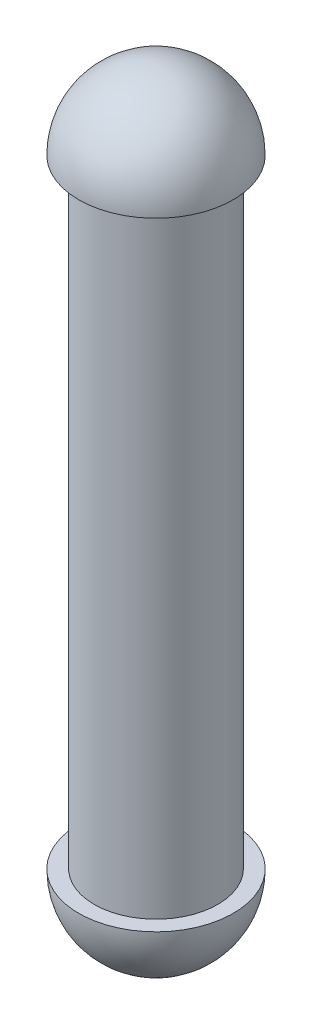
ISO-10303-21;
HEADER;
FILE_DESCRIPTION(('STEP AP214'),'2;1');
FILE_NAME('part.step','',(''),(''),'','','');
FILE_SCHEMA(('AUTOMOTIVE_DESIGN { 1 0 10303 214 1 1 1 1 }'));
ENDSEC;
DATA;
#1=APPLICATION_CONTEXT('core data for automotive mechanical design processes');
#2=APPLICATION_PROTOCOL_DEFINITION('international standard','automotive_design',2000,#1);
#3=PRODUCT_CONTEXT('',#1,'mechanical');
#4=PRODUCT('Part','Part','',(#3));
#5=PRODUCT_RELATED_PRODUCT_CATEGORY('part','',(#4));
#6=PRODUCT_DEFINITION_FORMATION('','',#4);
#7=PRODUCT_DEFINITION_CONTEXT('part definition',#1,'design');
#8=PRODUCT_DEFINITION('design','',#6,#7);
#9=PRODUCT_DEFINITION_SHAPE('','',#8);
#10=(LENGTH_UNIT() NAMED_UNIT(*) SI_UNIT(.MILLI.,.METRE.));
#11=(NAMED_UNIT(*) PLANE_ANGLE_UNIT() SI_UNIT($,.RADIAN.));
#12=(NAMED_UNIT(*) SI_UNIT($,.STERADIAN.) SOLID_ANGLE_UNIT());
#13=UNCERTAINTY_MEASURE_WITH_UNIT(LENGTH_MEASURE(1.E-05),#10,'distance_accuracy_value','');
#14=(GEOMETRIC_REPRESENTATION_CONTEXT(3) GLOBAL_UNCERTAINTY_ASSIGNED_CONTEXT((#13)) GLOBAL_UNIT_ASSIGNED_CONTEXT((#10,
#11,#12)) REPRESENTATION_CONTEXT('',''));
#15=CARTESIAN_POINT('',(0.,0.,0.));
#16=DIRECTION('',(0.,0.,1.));
#17=DIRECTION('',(1.,0.,0.));
#18=AXIS2_PLACEMENT_3D('',#15,#16,#17);
#19=CARTESIAN_POINT('',(0.,40.,0.));
#20=DIRECTION('',(0.,-1.,0.));
#21=DIRECTION('',(0.,0.,-1.));
#22=AXIS2_PLACEMENT_3D('',#19,#20,#21);
#23=CYLINDRICAL_SURFACE('',#22,4.);
#24=CARTESIAN_POINT('',(0.,40.,0.));
#25=DIRECTION('',(0.,1.,0.));
#26=DIRECTION('',(0.,0.,1.));
#27=AXIS2_PLACEMENT_3D('',#24,#25,#26);
#28=CIRCLE('',#27,4.);
#29=CARTESIAN_POINT('',(0.,40.,4.));
#30=VERTEX_POINT('',#29);
#31=EDGE_CURVE('E10',#30,#30,#28,.T.);
#32=ORIENTED_EDGE('',*,*,#31,.F.);
#33=EDGE_LOOP('',(#32));
#34=FACE_BOUND('',#33,.T.);
#35=CARTESIAN_POINT('',(0.,0.,0.));
#36=DIRECTION('',(0.,1.,0.));
#37=DIRECTION('',(0.,0.,1.));
#38=AXIS2_PLACEMENT_3D('',#35,#36,#37);
#39=CIRCLE('',#38,4.);
#40=CARTESIAN_POINT('',(0.,0.,4.));
#41=VERTEX_POINT('',#40);
#42=EDGE_CURVE('E41',#41,#41,#39,.T.);
#43=ORIENTED_EDGE('',*,*,#42,.T.);
#44=EDGE_LOOP('',(#43));
#45=FACE_BOUND('',#44,.T.);
#46=ADVANCED_FACE('F37',(#34,#45),#23,.T.);
#47=CARTESIAN_POINT('',(0.,40.,0.));
#48=DIRECTION('',(0.,1.,0.));
#49=DIRECTION('',(0.,0.,1.));
#50=AXIS2_PLACEMENT_3D('',#47,#48,#49);
#51=PLANE('',#50);
#52=ORIENTED_EDGE('',*,*,#31,.T.);
#53=EDGE_LOOP('',(#52));
#54=FACE_BOUND('',#53,.T.);
#55=CARTESIAN_POINT('',(0.,40.,0.));
#56=DIRECTION('',(0.,1.,0.));
#57=DIRECTION('',(0.,0.,1.));
#58=AXIS2_PLACEMENT_3D('',#55,#56,#57);
#59=CIRCLE('',#58,5.);
#60=CARTESIAN_POINT('',(0.,40.,5.));
#61=VERTEX_POINT('',#60);
#62=EDGE_CURVE('E46',#61,#61,#59,.T.);
#63=ORIENTED_EDGE('',*,*,#62,.F.);
#64=EDGE_LOOP('',(#63));
#65=FACE_BOUND('',#64,.T.);
#66=ADVANCED_FACE('F72',(#54,#65),#51,.F.);
#67=CARTESIAN_POINT('',(0.,40.,0.));
#68=DIRECTION('',(0.,1.,0.));
#69=DIRECTION('',(0.,0.,1.));
#70=AXIS2_PLACEMENT_3D('',#67,#68,#69);
#71=SPHERICAL_SURFACE('',#70,5.);
#72=ORIENTED_EDGE('',*,*,#62,.T.);
#73=EDGE_LOOP('',(#72));
#74=FACE_BOUND('',#73,.T.);
#75=ADVANCED_FACE('F66',(#74),#71,.T.);
#76=CARTESIAN_POINT('',(0.,0.,0.));
#77=DIRECTION('',(0.,-1.,0.));
#78=DIRECTION('',(0.,0.,-1.));
#79=AXIS2_PLACEMENT_3D('',#76,#77,#78);
#80=PLANE('',#79);
#81=ORIENTED_EDGE('',*,*,#42,.F.);
#82=EDGE_LOOP('',(#81));
#83=FACE_BOUND('',#82,.T.);
#84=CARTESIAN_POINT('',(0.,0.,0.));
#85=DIRECTION('',(0.,-1.,0.));
#86=DIRECTION('',(0.,0.,-1.));
#87=AXIS2_PLACEMENT_3D('',#84,#85,#86);
#88=CIRCLE('',#87,5.);
#89=CARTESIAN_POINT('',(0.,0.,-5.));
#90=VERTEX_POINT('',#89);
#91=EDGE_CURVE('E53',#90,#90,#88,.T.);
#92=ORIENTED_EDGE('',*,*,#91,.F.);
#93=EDGE_LOOP('',(#92));
#94=FACE_BOUND('',#93,.T.);
#95=ADVANCED_FACE('F63',(#83,#94),#80,.F.);
#96=CARTESIAN_POINT('',(0.,0.,0.));
#97=DIRECTION('',(0.,-1.,0.));
#98=DIRECTION('',(0.,0.,-1.));
#99=AXIS2_PLACEMENT_3D('',#96,#97,#98);
#100=SPHERICAL_SURFACE('',#99,5.);
#101=ORIENTED_EDGE('',*,*,#91,.T.);
#102=EDGE_LOOP('',(#101));
#103=FACE_BOUND('',#102,.T.);
#104=ADVANCED_FACE('F39',(#103),#100,.T.);
#105=CLOSED_SHELL('',(#46,#66,#75,#95,#104));
#106=MANIFOLD_SOLID_BREP('B2',#105);
#107=ADVANCED_BREP_SHAPE_REPRESENTATION('',(#18,#106),#14);
#108=SHAPE_DEFINITION_REPRESENTATION(#9,#107);
ENDSEC;
END-ISO-10303-21;
